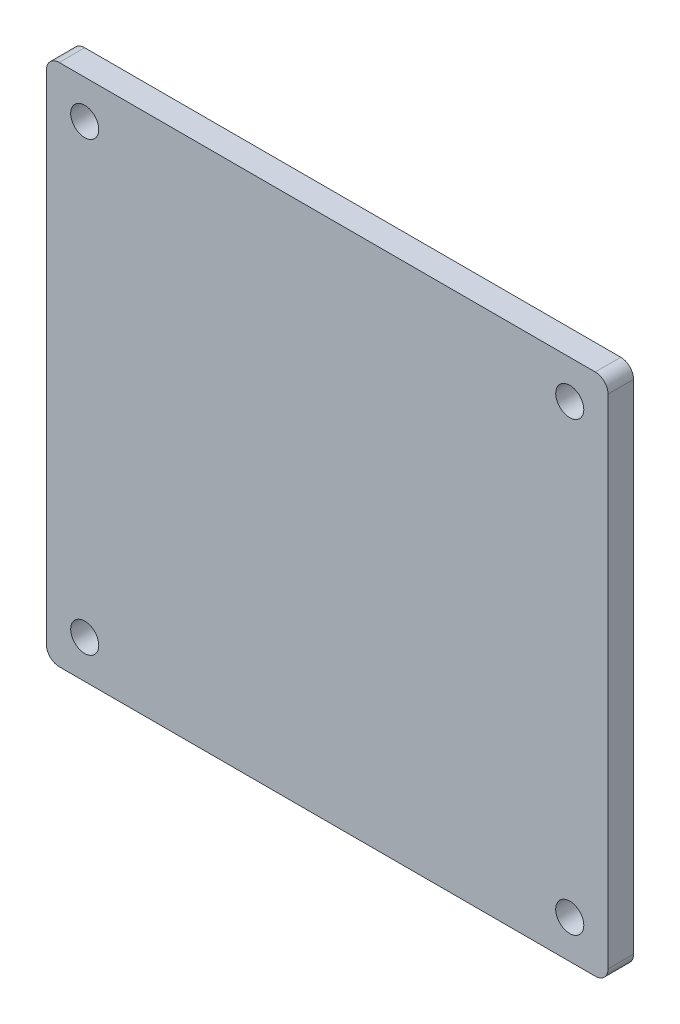
ISO-10303-21;
HEADER;
FILE_DESCRIPTION(('STEP AP214'),'2;1');
FILE_NAME('part.step','',(''),(''),'','','');
FILE_SCHEMA(('AUTOMOTIVE_DESIGN { 1 0 10303 214 1 1 1 1 }'));
ENDSEC;
DATA;
#1=APPLICATION_CONTEXT('core data for automotive mechanical design processes');
#2=APPLICATION_PROTOCOL_DEFINITION('international standard','automotive_design',2000,#1);
#3=PRODUCT_CONTEXT('',#1,'mechanical');
#4=PRODUCT('Part','Part','',(#3));
#5=PRODUCT_RELATED_PRODUCT_CATEGORY('part','',(#4));
#6=PRODUCT_DEFINITION_FORMATION('','',#4);
#7=PRODUCT_DEFINITION_CONTEXT('part definition',#1,'design');
#8=PRODUCT_DEFINITION('design','',#6,#7);
#9=PRODUCT_DEFINITION_SHAPE('','',#8);
#10=(LENGTH_UNIT() NAMED_UNIT(*) SI_UNIT(.MILLI.,.METRE.));
#11=(NAMED_UNIT(*) PLANE_ANGLE_UNIT() SI_UNIT($,.RADIAN.));
#12=(NAMED_UNIT(*) SI_UNIT($,.STERADIAN.) SOLID_ANGLE_UNIT());
#13=UNCERTAINTY_MEASURE_WITH_UNIT(LENGTH_MEASURE(1.E-05),#10,'distance_accuracy_value','');
#14=(GEOMETRIC_REPRESENTATION_CONTEXT(3) GLOBAL_UNCERTAINTY_ASSIGNED_CONTEXT((#13)) GLOBAL_UNIT_ASSIGNED_CONTEXT((#10,
#11,#12)) REPRESENTATION_CONTEXT('',''));
#15=CARTESIAN_POINT('',(0.,0.,0.));
#16=DIRECTION('',(0.,0.,1.));
#17=DIRECTION('',(1.,0.,0.));
#18=AXIS2_PLACEMENT_3D('',#15,#16,#17);
#19=CARTESIAN_POINT('',(22.,-20.5,2.));
#20=DIRECTION('',(-1.,0.,0.));
#21=DIRECTION('',(0.,0.,1.));
#22=AXIS2_PLACEMENT_3D('',#19,#20,#21);
#23=PLANE('',#22);
#24=DIRECTION('',(0.,1.,0.));
#25=VECTOR('',#24,1.);
#26=CARTESIAN_POINT('',(22.,-20.5,2.));
#27=LINE('',#26,#25);
#28=CARTESIAN_POINT('',(22.,-19.5,2.));
#29=VERTEX_POINT('',#28);
#30=CARTESIAN_POINT('',(22.,19.5,2.));
#31=VERTEX_POINT('',#30);
#32=EDGE_CURVE('E121',#29,#31,#27,.T.);
#33=ORIENTED_EDGE('',*,*,#32,.F.);
#34=DIRECTION('',(0.,0.,-1.));
#35=VECTOR('',#34,1.);
#36=CARTESIAN_POINT('',(22.,-19.5,2.));
#37=LINE('',#36,#35);
#38=CARTESIAN_POINT('',(22.,-19.5,0.));
#39=VERTEX_POINT('',#38);
#40=EDGE_CURVE('E106',#29,#39,#37,.T.);
#41=ORIENTED_EDGE('',*,*,#40,.T.);
#42=DIRECTION('',(0.,1.,0.));
#43=VECTOR('',#42,1.);
#44=CARTESIAN_POINT('',(22.,-20.5,0.));
#45=LINE('',#44,#43);
#46=CARTESIAN_POINT('',(22.,19.5,0.));
#47=VERTEX_POINT('',#46);
#48=EDGE_CURVE('E118',#39,#47,#45,.T.);
#49=ORIENTED_EDGE('',*,*,#48,.T.);
#50=DIRECTION('',(0.,0.,-1.));
#51=VECTOR('',#50,1.);
#52=CARTESIAN_POINT('',(22.,19.5,2.));
#53=LINE('',#52,#51);
#54=EDGE_CURVE('E123',#47,#31,#53,.F.);
#55=ORIENTED_EDGE('',*,*,#54,.T.);
#56=EDGE_LOOP('',(#33,#41,#49,#55));
#57=FACE_BOUND('',#56,.T.);
#58=ADVANCED_FACE('F36',(#57),#23,.F.);
#59=CARTESIAN_POINT('',(-22.,20.5,2.));
#60=DIRECTION('',(0.,-1.,0.));
#61=DIRECTION('',(0.,0.,-1.));
#62=AXIS2_PLACEMENT_3D('',#59,#60,#61);
#63=PLANE('',#62);
#64=DIRECTION('',(-1.,0.,0.));
#65=VECTOR('',#64,1.);
#66=CARTESIAN_POINT('',(-22.,20.5,0.));
#67=LINE('',#66,#65);
#68=CARTESIAN_POINT('',(21.,20.5,0.));
#69=VERTEX_POINT('',#68);
#70=CARTESIAN_POINT('',(-21.,20.5,0.));
#71=VERTEX_POINT('',#70);
#72=EDGE_CURVE('E127',#69,#71,#67,.T.);
#73=ORIENTED_EDGE('',*,*,#72,.T.);
#74=DIRECTION('',(0.,0.,-1.));
#75=VECTOR('',#74,1.);
#76=CARTESIAN_POINT('',(-21.,20.5,2.));
#77=LINE('',#76,#75);
#78=CARTESIAN_POINT('',(-21.,20.5,2.));
#79=VERTEX_POINT('',#78);
#80=EDGE_CURVE('E11',#71,#79,#77,.F.);
#81=ORIENTED_EDGE('',*,*,#80,.T.);
#82=DIRECTION('',(-1.,0.,0.));
#83=VECTOR('',#82,1.);
#84=CARTESIAN_POINT('',(-22.,20.5,2.));
#85=LINE('',#84,#83);
#86=CARTESIAN_POINT('',(21.,20.5,2.));
#87=VERTEX_POINT('',#86);
#88=EDGE_CURVE('E167',#87,#79,#85,.T.);
#89=ORIENTED_EDGE('',*,*,#88,.F.);
#90=DIRECTION('',(0.,0.,-1.));
#91=VECTOR('',#90,1.);
#92=CARTESIAN_POINT('',(21.,20.5,2.));
#93=LINE('',#92,#91);
#94=EDGE_CURVE('E44',#87,#69,#93,.T.);
#95=ORIENTED_EDGE('',*,*,#94,.T.);
#96=EDGE_LOOP('',(#73,#81,#89,#95));
#97=FACE_BOUND('',#96,.T.);
#98=ADVANCED_FACE('F165',(#97),#63,.F.);
#99=CARTESIAN_POINT('',(-22.,-20.5,2.));
#100=DIRECTION('',(1.,0.,0.));
#101=DIRECTION('',(0.,0.,-1.));
#102=AXIS2_PLACEMENT_3D('',#99,#100,#101);
#103=PLANE('',#102);
#104=DIRECTION('',(0.,-1.,0.));
#105=VECTOR('',#104,1.);
#106=CARTESIAN_POINT('',(-22.,-20.5,0.));
#107=LINE('',#106,#105);
#108=CARTESIAN_POINT('',(-22.,19.5,0.));
#109=VERTEX_POINT('',#108);
#110=CARTESIAN_POINT('',(-22.,-19.5,0.));
#111=VERTEX_POINT('',#110);
#112=EDGE_CURVE('E131',#109,#111,#107,.T.);
#113=ORIENTED_EDGE('',*,*,#112,.T.);
#114=DIRECTION('',(0.,0.,-1.));
#115=VECTOR('',#114,1.);
#116=CARTESIAN_POINT('',(-22.,-19.5,2.));
#117=LINE('',#116,#115);
#118=CARTESIAN_POINT('',(-22.,-19.5,2.));
#119=VERTEX_POINT('',#118);
#120=EDGE_CURVE('E51',#111,#119,#117,.F.);
#121=ORIENTED_EDGE('',*,*,#120,.T.);
#122=DIRECTION('',(0.,-1.,0.));
#123=VECTOR('',#122,1.);
#124=CARTESIAN_POINT('',(-22.,-20.5,2.));
#125=LINE('',#124,#123);
#126=CARTESIAN_POINT('',(-22.,19.5,2.));
#127=VERTEX_POINT('',#126);
#128=EDGE_CURVE('E175',#127,#119,#125,.T.);
#129=ORIENTED_EDGE('',*,*,#128,.F.);
#130=DIRECTION('',(0.,0.,-1.));
#131=VECTOR('',#130,1.);
#132=CARTESIAN_POINT('',(-22.,19.5,2.));
#133=LINE('',#132,#131);
#134=EDGE_CURVE('E158',#127,#109,#133,.T.);
#135=ORIENTED_EDGE('',*,*,#134,.T.);
#136=EDGE_LOOP('',(#113,#121,#129,#135));
#137=FACE_BOUND('',#136,.T.);
#138=ADVANCED_FACE('F174',(#137),#103,.F.);
#139=CARTESIAN_POINT('',(-22.,-20.5,2.));
#140=DIRECTION('',(0.,1.,0.));
#141=DIRECTION('',(0.,0.,1.));
#142=AXIS2_PLACEMENT_3D('',#139,#140,#141);
#143=PLANE('',#142);
#144=DIRECTION('',(1.,0.,0.));
#145=VECTOR('',#144,1.);
#146=CARTESIAN_POINT('',(-22.,-20.5,0.));
#147=LINE('',#146,#145);
#148=CARTESIAN_POINT('',(-21.,-20.5,0.));
#149=VERTEX_POINT('',#148);
#150=CARTESIAN_POINT('',(21.,-20.5,0.));
#151=VERTEX_POINT('',#150);
#152=EDGE_CURVE('E141',#149,#151,#147,.T.);
#153=ORIENTED_EDGE('',*,*,#152,.T.);
#154=DIRECTION('',(0.,0.,-1.));
#155=VECTOR('',#154,1.);
#156=CARTESIAN_POINT('',(21.,-20.5,2.));
#157=LINE('',#156,#155);
#158=CARTESIAN_POINT('',(21.,-20.5,2.));
#159=VERTEX_POINT('',#158);
#160=EDGE_CURVE('E107',#151,#159,#157,.F.);
#161=ORIENTED_EDGE('',*,*,#160,.T.);
#162=DIRECTION('',(1.,0.,0.));
#163=VECTOR('',#162,1.);
#164=CARTESIAN_POINT('',(-22.,-20.5,2.));
#165=LINE('',#164,#163);
#166=CARTESIAN_POINT('',(-21.,-20.5,2.));
#167=VERTEX_POINT('',#166);
#168=EDGE_CURVE('E137',#167,#159,#165,.T.);
#169=ORIENTED_EDGE('',*,*,#168,.F.);
#170=DIRECTION('',(0.,0.,-1.));
#171=VECTOR('',#170,1.);
#172=CARTESIAN_POINT('',(-21.,-20.5,2.));
#173=LINE('',#172,#171);
#174=EDGE_CURVE('E112',#167,#149,#173,.T.);
#175=ORIENTED_EDGE('',*,*,#174,.T.);
#176=EDGE_LOOP('',(#153,#161,#169,#175));
#177=FACE_BOUND('',#176,.T.);
#178=ADVANCED_FACE('F215',(#177),#143,.F.);
#179=CARTESIAN_POINT('',(0.,0.,2.));
#180=DIRECTION('',(0.,0.,-1.));
#181=DIRECTION('',(-1.,0.,0.));
#182=AXIS2_PLACEMENT_3D('',#179,#180,#181);
#183=PLANE('',#182);
#184=CARTESIAN_POINT('',(19.,-17.5,2.));
#185=DIRECTION('',(0.,0.,1.));
#186=DIRECTION('',(1.,0.,0.));
#187=AXIS2_PLACEMENT_3D('',#184,#185,#186);
#188=CIRCLE('',#187,1.1);
#189=CARTESIAN_POINT('',(20.1,-17.5,2.));
#190=VERTEX_POINT('',#189);
#191=EDGE_CURVE('E184',#190,#190,#188,.T.);
#192=ORIENTED_EDGE('',*,*,#191,.F.);
#193=EDGE_LOOP('',(#192));
#194=FACE_BOUND('',#193,.T.);
#195=CARTESIAN_POINT('',(-19.,-17.5,2.));
#196=DIRECTION('',(0.,0.,1.));
#197=DIRECTION('',(1.,0.,0.));
#198=AXIS2_PLACEMENT_3D('',#195,#196,#197);
#199=CIRCLE('',#198,1.1);
#200=CARTESIAN_POINT('',(-17.9,-17.5,2.));
#201=VERTEX_POINT('',#200);
#202=EDGE_CURVE('E190',#201,#201,#199,.T.);
#203=ORIENTED_EDGE('',*,*,#202,.F.);
#204=EDGE_LOOP('',(#203));
#205=FACE_BOUND('',#204,.T.);
#206=CARTESIAN_POINT('',(-19.,17.5,2.));
#207=DIRECTION('',(0.,0.,1.));
#208=DIRECTION('',(1.,0.,0.));
#209=AXIS2_PLACEMENT_3D('',#206,#207,#208);
#210=CIRCLE('',#209,1.1);
#211=CARTESIAN_POINT('',(-17.9,17.5,2.));
#212=VERTEX_POINT('',#211);
#213=EDGE_CURVE('E196',#212,#212,#210,.T.);
#214=ORIENTED_EDGE('',*,*,#213,.F.);
#215=EDGE_LOOP('',(#214));
#216=FACE_BOUND('',#215,.T.);
#217=CARTESIAN_POINT('',(19.,17.5,2.));
#218=DIRECTION('',(0.,0.,1.));
#219=DIRECTION('',(1.,0.,0.));
#220=AXIS2_PLACEMENT_3D('',#217,#218,#219);
#221=CIRCLE('',#220,1.1);
#222=CARTESIAN_POINT('',(20.1,17.5,2.));
#223=VERTEX_POINT('',#222);
#224=EDGE_CURVE('E134',#223,#223,#221,.T.);
#225=ORIENTED_EDGE('',*,*,#224,.F.);
#226=EDGE_LOOP('',(#225));
#227=FACE_BOUND('',#226,.T.);
#228=ORIENTED_EDGE('',*,*,#168,.T.);
#229=CARTESIAN_POINT('',(21.,-19.5,2.));
#230=DIRECTION('',(0.,0.,-1.));
#231=DIRECTION('',(-1.,0.,0.));
#232=AXIS2_PLACEMENT_3D('',#229,#230,#231);
#233=CIRCLE('',#232,1.);
#234=EDGE_CURVE('E156',#159,#29,#233,.F.);
#235=ORIENTED_EDGE('',*,*,#234,.T.);
#236=ORIENTED_EDGE('',*,*,#32,.T.);
#237=CARTESIAN_POINT('',(21.,19.5,2.));
#238=DIRECTION('',(0.,0.,-1.));
#239=DIRECTION('',(-1.,0.,0.));
#240=AXIS2_PLACEMENT_3D('',#237,#238,#239);
#241=CIRCLE('',#240,1.);
#242=EDGE_CURVE('E151',#31,#87,#241,.F.);
#243=ORIENTED_EDGE('',*,*,#242,.T.);
#244=ORIENTED_EDGE('',*,*,#88,.T.);
#245=CARTESIAN_POINT('',(-21.,19.5,2.));
#246=DIRECTION('',(0.,0.,-1.));
#247=DIRECTION('',(-1.,0.,0.));
#248=AXIS2_PLACEMENT_3D('',#245,#246,#247);
#249=CIRCLE('',#248,1.);
#250=EDGE_CURVE('E58',#79,#127,#249,.F.);
#251=ORIENTED_EDGE('',*,*,#250,.T.);
#252=ORIENTED_EDGE('',*,*,#128,.T.);
#253=CARTESIAN_POINT('',(-21.,-19.5,2.));
#254=DIRECTION('',(0.,0.,-1.));
#255=DIRECTION('',(-1.,0.,0.));
#256=AXIS2_PLACEMENT_3D('',#253,#254,#255);
#257=CIRCLE('',#256,1.);
#258=EDGE_CURVE('E154',#119,#167,#257,.F.);
#259=ORIENTED_EDGE('',*,*,#258,.T.);
#260=EDGE_LOOP('',(#228,#235,#236,#243,#244,#251,#252,#259));
#261=FACE_BOUND('',#260,.T.);
#262=ADVANCED_FACE('F212',(#194,#205,#216,#227,#261),#183,.F.);
#263=CARTESIAN_POINT('',(0.,0.,0.));
#264=DIRECTION('',(0.,0.,-1.));
#265=DIRECTION('',(-1.,0.,0.));
#266=AXIS2_PLACEMENT_3D('',#263,#264,#265);
#267=PLANE('',#266);
#268=CARTESIAN_POINT('',(19.,-17.5,0.));
#269=DIRECTION('',(0.,0.,1.));
#270=DIRECTION('',(1.,0.,0.));
#271=AXIS2_PLACEMENT_3D('',#268,#269,#270);
#272=CIRCLE('',#271,1.1);
#273=CARTESIAN_POINT('',(20.1,-17.5,0.));
#274=VERTEX_POINT('',#273);
#275=EDGE_CURVE('E187',#274,#274,#272,.T.);
#276=ORIENTED_EDGE('',*,*,#275,.T.);
#277=EDGE_LOOP('',(#276));
#278=FACE_BOUND('',#277,.T.);
#279=CARTESIAN_POINT('',(-19.,-17.5,0.));
#280=DIRECTION('',(0.,0.,1.));
#281=DIRECTION('',(1.,0.,0.));
#282=AXIS2_PLACEMENT_3D('',#279,#280,#281);
#283=CIRCLE('',#282,1.1);
#284=CARTESIAN_POINT('',(-17.9,-17.5,0.));
#285=VERTEX_POINT('',#284);
#286=EDGE_CURVE('E193',#285,#285,#283,.T.);
#287=ORIENTED_EDGE('',*,*,#286,.T.);
#288=EDGE_LOOP('',(#287));
#289=FACE_BOUND('',#288,.T.);
#290=CARTESIAN_POINT('',(-19.,17.5,0.));
#291=DIRECTION('',(0.,0.,1.));
#292=DIRECTION('',(1.,0.,0.));
#293=AXIS2_PLACEMENT_3D('',#290,#291,#292);
#294=CIRCLE('',#293,1.1);
#295=CARTESIAN_POINT('',(-17.9,17.5,0.));
#296=VERTEX_POINT('',#295);
#297=EDGE_CURVE('E182',#296,#296,#294,.T.);
#298=ORIENTED_EDGE('',*,*,#297,.T.);
#299=EDGE_LOOP('',(#298));
#300=FACE_BOUND('',#299,.T.);
#301=CARTESIAN_POINT('',(19.,17.5,0.));
#302=DIRECTION('',(0.,0.,1.));
#303=DIRECTION('',(1.,0.,0.));
#304=AXIS2_PLACEMENT_3D('',#301,#302,#303);
#305=CIRCLE('',#304,1.1);
#306=CARTESIAN_POINT('',(20.1,17.5,0.));
#307=VERTEX_POINT('',#306);
#308=EDGE_CURVE('E128',#307,#307,#305,.T.);
#309=ORIENTED_EDGE('',*,*,#308,.T.);
#310=EDGE_LOOP('',(#309));
#311=FACE_BOUND('',#310,.T.);
#312=ORIENTED_EDGE('',*,*,#48,.F.);
#313=CARTESIAN_POINT('',(21.,-19.5,0.));
#314=DIRECTION('',(0.,0.,-1.));
#315=DIRECTION('',(-1.,0.,0.));
#316=AXIS2_PLACEMENT_3D('',#313,#314,#315);
#317=CIRCLE('',#316,1.);
#318=EDGE_CURVE('E102',#39,#151,#317,.T.);
#319=ORIENTED_EDGE('',*,*,#318,.T.);
#320=ORIENTED_EDGE('',*,*,#152,.F.);
#321=CARTESIAN_POINT('',(-21.,-19.5,0.));
#322=DIRECTION('',(0.,0.,-1.));
#323=DIRECTION('',(-1.,0.,0.));
#324=AXIS2_PLACEMENT_3D('',#321,#322,#323);
#325=CIRCLE('',#324,1.);
#326=EDGE_CURVE('E113',#149,#111,#325,.T.);
#327=ORIENTED_EDGE('',*,*,#326,.T.);
#328=ORIENTED_EDGE('',*,*,#112,.F.);
#329=CARTESIAN_POINT('',(-21.,19.5,0.));
#330=DIRECTION('',(0.,0.,-1.));
#331=DIRECTION('',(-1.,0.,0.));
#332=AXIS2_PLACEMENT_3D('',#329,#330,#331);
#333=CIRCLE('',#332,1.);
#334=EDGE_CURVE('E145',#109,#71,#333,.T.);
#335=ORIENTED_EDGE('',*,*,#334,.T.);
#336=ORIENTED_EDGE('',*,*,#72,.F.);
#337=CARTESIAN_POINT('',(21.,19.5,0.));
#338=DIRECTION('',(0.,0.,-1.));
#339=DIRECTION('',(-1.,0.,0.));
#340=AXIS2_PLACEMENT_3D('',#337,#338,#339);
#341=CIRCLE('',#340,1.);
#342=EDGE_CURVE('E122',#69,#47,#341,.T.);
#343=ORIENTED_EDGE('',*,*,#342,.T.);
#344=EDGE_LOOP('',(#312,#319,#320,#327,#328,#335,#336,#343));
#345=FACE_BOUND('',#344,.T.);
#346=ADVANCED_FACE('F125',(#278,#289,#300,#311,#345),#267,.T.);
#347=CARTESIAN_POINT('',(19.,17.5,0.));
#348=DIRECTION('',(0.,0.,1.));
#349=DIRECTION('',(1.,0.,0.));
#350=AXIS2_PLACEMENT_3D('',#347,#348,#349);
#351=CYLINDRICAL_SURFACE('',#350,1.1);
#352=ORIENTED_EDGE('',*,*,#308,.F.);
#353=EDGE_LOOP('',(#352));
#354=FACE_BOUND('',#353,.T.);
#355=ORIENTED_EDGE('',*,*,#224,.T.);
#356=EDGE_LOOP('',(#355));
#357=FACE_BOUND('',#356,.T.);
#358=ADVANCED_FACE('F208',(#354,#357),#351,.F.);
#359=CARTESIAN_POINT('',(-19.,17.5,0.));
#360=DIRECTION('',(0.,0.,1.));
#361=DIRECTION('',(1.,0.,0.));
#362=AXIS2_PLACEMENT_3D('',#359,#360,#361);
#363=CYLINDRICAL_SURFACE('',#362,1.1);
#364=ORIENTED_EDGE('',*,*,#297,.F.);
#365=EDGE_LOOP('',(#364));
#366=FACE_BOUND('',#365,.T.);
#367=ORIENTED_EDGE('',*,*,#213,.T.);
#368=EDGE_LOOP('',(#367));
#369=FACE_BOUND('',#368,.T.);
#370=ADVANCED_FACE('F204',(#366,#369),#363,.F.);
#371=CARTESIAN_POINT('',(-19.,-17.5,0.));
#372=DIRECTION('',(0.,0.,1.));
#373=DIRECTION('',(1.,0.,0.));
#374=AXIS2_PLACEMENT_3D('',#371,#372,#373);
#375=CYLINDRICAL_SURFACE('',#374,1.1);
#376=ORIENTED_EDGE('',*,*,#286,.F.);
#377=EDGE_LOOP('',(#376));
#378=FACE_BOUND('',#377,.T.);
#379=ORIENTED_EDGE('',*,*,#202,.T.);
#380=EDGE_LOOP('',(#379));
#381=FACE_BOUND('',#380,.T.);
#382=ADVANCED_FACE('F207',(#378,#381),#375,.F.);
#383=CARTESIAN_POINT('',(19.,-17.5,0.));
#384=DIRECTION('',(0.,0.,1.));
#385=DIRECTION('',(1.,0.,0.));
#386=AXIS2_PLACEMENT_3D('',#383,#384,#385);
#387=CYLINDRICAL_SURFACE('',#386,1.1);
#388=ORIENTED_EDGE('',*,*,#275,.F.);
#389=EDGE_LOOP('',(#388));
#390=FACE_BOUND('',#389,.T.);
#391=ORIENTED_EDGE('',*,*,#191,.T.);
#392=EDGE_LOOP('',(#391));
#393=FACE_BOUND('',#392,.T.);
#394=ADVANCED_FACE('F230',(#390,#393),#387,.F.);
#395=CARTESIAN_POINT('',(21.,-19.5,2.));
#396=DIRECTION('',(0.,0.,-1.));
#397=DIRECTION('',(-1.,0.,0.));
#398=AXIS2_PLACEMENT_3D('',#395,#396,#397);
#399=CYLINDRICAL_SURFACE('',#398,1.);
#400=ORIENTED_EDGE('',*,*,#234,.F.);
#401=ORIENTED_EDGE('',*,*,#160,.F.);
#402=ORIENTED_EDGE('',*,*,#318,.F.);
#403=ORIENTED_EDGE('',*,*,#40,.F.);
#404=EDGE_LOOP('',(#400,#401,#402,#403));
#405=FACE_BOUND('',#404,.T.);
#406=ADVANCED_FACE('F105',(#405),#399,.T.);
#407=CARTESIAN_POINT('',(-21.,-19.5,2.));
#408=DIRECTION('',(0.,0.,-1.));
#409=DIRECTION('',(-1.,0.,0.));
#410=AXIS2_PLACEMENT_3D('',#407,#408,#409);
#411=CYLINDRICAL_SURFACE('',#410,1.);
#412=ORIENTED_EDGE('',*,*,#258,.F.);
#413=ORIENTED_EDGE('',*,*,#120,.F.);
#414=ORIENTED_EDGE('',*,*,#326,.F.);
#415=ORIENTED_EDGE('',*,*,#174,.F.);
#416=EDGE_LOOP('',(#412,#413,#414,#415));
#417=FACE_BOUND('',#416,.T.);
#418=ADVANCED_FACE('F223',(#417),#411,.T.);
#419=CARTESIAN_POINT('',(-21.,19.5,2.));
#420=DIRECTION('',(0.,0.,-1.));
#421=DIRECTION('',(-1.,0.,0.));
#422=AXIS2_PLACEMENT_3D('',#419,#420,#421);
#423=CYLINDRICAL_SURFACE('',#422,1.);
#424=ORIENTED_EDGE('',*,*,#250,.F.);
#425=ORIENTED_EDGE('',*,*,#80,.F.);
#426=ORIENTED_EDGE('',*,*,#334,.F.);
#427=ORIENTED_EDGE('',*,*,#134,.F.);
#428=EDGE_LOOP('',(#424,#425,#426,#427));
#429=FACE_BOUND('',#428,.T.);
#430=ADVANCED_FACE('F173',(#429),#423,.T.);
#431=CARTESIAN_POINT('',(21.,19.5,2.));
#432=DIRECTION('',(0.,0.,-1.));
#433=DIRECTION('',(-1.,0.,0.));
#434=AXIS2_PLACEMENT_3D('',#431,#432,#433);
#435=CYLINDRICAL_SURFACE('',#434,1.);
#436=ORIENTED_EDGE('',*,*,#242,.F.);
#437=ORIENTED_EDGE('',*,*,#54,.F.);
#438=ORIENTED_EDGE('',*,*,#342,.F.);
#439=ORIENTED_EDGE('',*,*,#94,.F.);
#440=EDGE_LOOP('',(#436,#437,#438,#439));
#441=FACE_BOUND('',#440,.T.);
#442=ADVANCED_FACE('F38',(#441),#435,.T.);
#443=CLOSED_SHELL('',(#58,#98,#138,#178,#262,#346,#358,#370,#382,#394,#406,#418,#430,#442));
#444=MANIFOLD_SOLID_BREP('B2',#443);
#445=ADVANCED_BREP_SHAPE_REPRESENTATION('',(#18,#444),#14);
#446=SHAPE_DEFINITION_REPRESENTATION(#9,#445);
ENDSEC;
END-ISO-10303-21;
